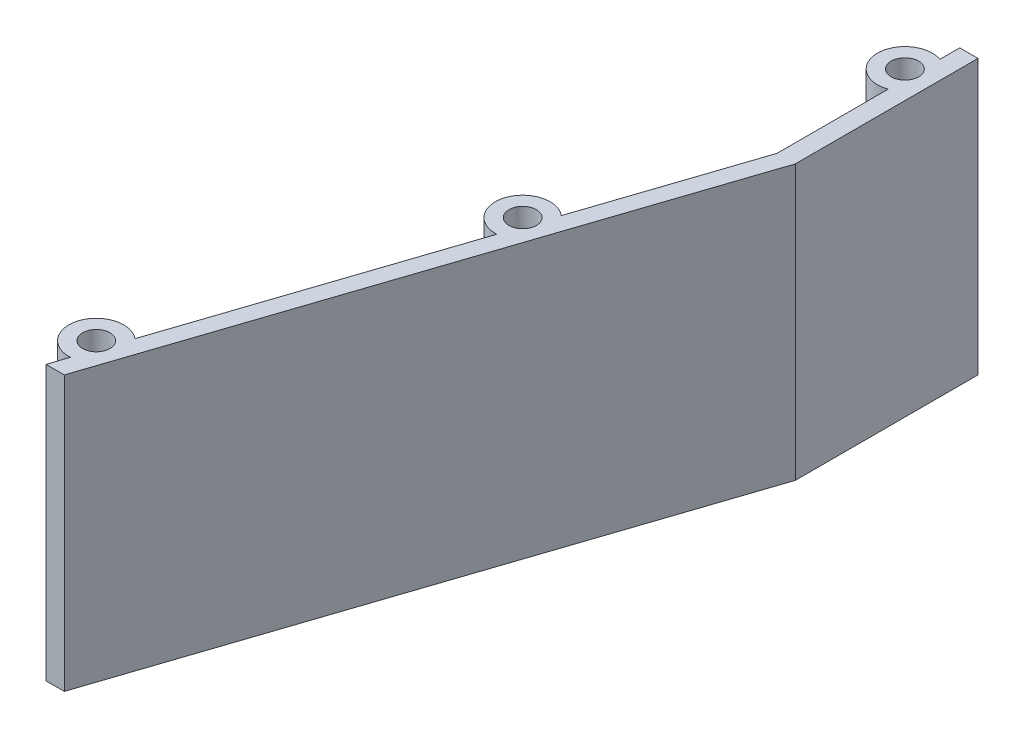
ISO-10303-21;
HEADER;
FILE_DESCRIPTION(('STEP AP214'),'2;1');
FILE_NAME('part.step','',(''),(''),'','','');
FILE_SCHEMA(('AUTOMOTIVE_DESIGN { 1 0 10303 214 1 1 1 1 }'));
ENDSEC;
DATA;
#1=APPLICATION_CONTEXT('core data for automotive mechanical design processes');
#2=APPLICATION_PROTOCOL_DEFINITION('international standard','automotive_design',2000,#1);
#3=PRODUCT_CONTEXT('',#1,'mechanical');
#4=PRODUCT('Part','Part','',(#3));
#5=PRODUCT_RELATED_PRODUCT_CATEGORY('part','',(#4));
#6=PRODUCT_DEFINITION_FORMATION('','',#4);
#7=PRODUCT_DEFINITION_CONTEXT('part definition',#1,'design');
#8=PRODUCT_DEFINITION('design','',#6,#7);
#9=PRODUCT_DEFINITION_SHAPE('','',#8);
#10=(LENGTH_UNIT() NAMED_UNIT(*) SI_UNIT(.MILLI.,.METRE.));
#11=(NAMED_UNIT(*) PLANE_ANGLE_UNIT() SI_UNIT($,.RADIAN.));
#12=(NAMED_UNIT(*) SI_UNIT($,.STERADIAN.) SOLID_ANGLE_UNIT());
#13=UNCERTAINTY_MEASURE_WITH_UNIT(LENGTH_MEASURE(1.E-05),#10,'distance_accuracy_value','');
#14=(GEOMETRIC_REPRESENTATION_CONTEXT(3) GLOBAL_UNCERTAINTY_ASSIGNED_CONTEXT((#13)) GLOBAL_UNIT_ASSIGNED_CONTEXT((#10,
#11,#12)) REPRESENTATION_CONTEXT('',''));
#15=CARTESIAN_POINT('',(0.,0.,0.));
#16=DIRECTION('',(0.,0.,1.));
#17=DIRECTION('',(1.,0.,0.));
#18=AXIS2_PLACEMENT_3D('',#15,#16,#17);
#19=CARTESIAN_POINT('',(-7.82894432683504,30.,20.));
#20=DIRECTION('',(0.,1.,0.));
#21=DIRECTION('',(0.,0.,1.));
#22=AXIS2_PLACEMENT_3D('',#19,#20,#21);
#23=PLANE('',#22);
#24=CARTESIAN_POINT('',(-1.,30.,-15.));
#25=DIRECTION('',(0.,1.,0.));
#26=DIRECTION('',(0.,0.,1.));
#27=AXIS2_PLACEMENT_3D('',#24,#25,#26);
#28=CIRCLE('',#27,1.5);
#29=CARTESIAN_POINT('',(-1.,30.,-13.5));
#30=VERTEX_POINT('',#29);
#31=EDGE_CURVE('E294',#30,#30,#28,.T.);
#32=ORIENTED_EDGE('',*,*,#31,.F.);
#33=EDGE_LOOP('',(#32));
#34=FACE_BOUND('',#33,.T.);
#35=DIRECTION('',(0.,0.,1.));
#36=VECTOR('',#35,1.);
#37=CARTESIAN_POINT('',(0.,30.,-12.1715728752538));
#38=LINE('',#37,#36);
#39=CARTESIAN_POINT('',(0.,30.,-12.1715728752538));
#40=VERTEX_POINT('',#39);
#41=CARTESIAN_POINT('',(0.,30.,0.));
#42=VERTEX_POINT('',#41);
#43=EDGE_CURVE('E185',#40,#42,#38,.T.);
#44=ORIENTED_EDGE('',*,*,#43,.T.);
#45=DIRECTION('',(-0.316227766016838,0.,0.948683298050514));
#46=VECTOR('',#45,1.);
#47=CARTESIAN_POINT('',(0.,30.,0.));
#48=LINE('',#47,#46);
#49=CARTESIAN_POINT('',(-5.90061332234473,30.,17.7018399670342));
#50=VERTEX_POINT('',#49);
#51=EDGE_CURVE('E113',#42,#50,#48,.T.);
#52=ORIENTED_EDGE('',*,*,#51,.T.);
#53=CARTESIAN_POINT('',(-7.82894432683504,30.,20.));
#54=DIRECTION('',(0.,1.,0.));
#55=DIRECTION('',(0.,0.,1.));
#56=AXIS2_PLACEMENT_3D('',#53,#54,#55);
#57=CIRCLE('',#56,3.);
#58=CARTESIAN_POINT('',(-7.66517554302228,30.,22.9955266290668));
#59=VERTEX_POINT('',#58);
#60=EDGE_CURVE('E212',#50,#59,#57,.T.);
#61=ORIENTED_EDGE('',*,*,#60,.T.);
#62=DIRECTION('',(-0.316227766016838,0.,0.948683298050514));
#63=VECTOR('',#62,1.);
#64=CARTESIAN_POINT('',(-7.66517554302228,30.,22.9955266290668));
#65=LINE('',#64,#63);
#66=CARTESIAN_POINT('',(-17.5672799890114,30.,52.7018399670342));
#67=VERTEX_POINT('',#66);
#68=EDGE_CURVE('E231',#59,#67,#65,.T.);
#69=ORIENTED_EDGE('',*,*,#68,.T.);
#70=CARTESIAN_POINT('',(-19.4956109935017,30.,55.));
#71=DIRECTION('',(0.,1.,0.));
#72=DIRECTION('',(0.,0.,1.));
#73=AXIS2_PLACEMENT_3D('',#70,#71,#72);
#74=CIRCLE('',#73,3.);
#75=CARTESIAN_POINT('',(-19.3318422096889,30.,57.9955266290668));
#76=VERTEX_POINT('',#75);
#77=EDGE_CURVE('E228',#67,#76,#74,.T.);
#78=ORIENTED_EDGE('',*,*,#77,.T.);
#79=DIRECTION('',(-0.316227766016838,0.,0.948683298050514));
#80=VECTOR('',#79,1.);
#81=CARTESIAN_POINT('',(-19.3318422096889,30.,57.9955266290668));
#82=LINE('',#81,#80);
#83=CARTESIAN_POINT('',(-20.,30.,60.));
#84=VERTEX_POINT('',#83);
#85=EDGE_CURVE('E230',#76,#84,#82,.T.);
#86=ORIENTED_EDGE('',*,*,#85,.T.);
#87=DIRECTION('',(1.,0.,0.));
#88=VECTOR('',#87,1.);
#89=CARTESIAN_POINT('',(-20.,30.,60.));
#90=LINE('',#89,#88);
#91=CARTESIAN_POINT('',(-18.,30.,60.));
#92=VERTEX_POINT('',#91);
#93=EDGE_CURVE('E233',#84,#92,#90,.T.);
#94=ORIENTED_EDGE('',*,*,#93,.T.);
#95=DIRECTION('',(0.316227766016838,0.,-0.948683298050514));
#96=VECTOR('',#95,1.);
#97=CARTESIAN_POINT('',(-18.,30.,60.));
#98=LINE('',#97,#96);
#99=CARTESIAN_POINT('',(2.,30.,0.));
#100=VERTEX_POINT('',#99);
#101=EDGE_CURVE('E239',#92,#100,#98,.T.);
#102=ORIENTED_EDGE('',*,*,#101,.T.);
#103=DIRECTION('',(0.,0.,-1.));
#104=VECTOR('',#103,1.);
#105=CARTESIAN_POINT('',(2.,30.,0.));
#106=LINE('',#105,#104);
#107=CARTESIAN_POINT('',(2.,30.,-20.));
#108=VERTEX_POINT('',#107);
#109=EDGE_CURVE('E144',#100,#108,#106,.T.);
#110=ORIENTED_EDGE('',*,*,#109,.T.);
#111=DIRECTION('',(-1.,0.,0.));
#112=VECTOR('',#111,1.);
#113=CARTESIAN_POINT('',(2.,30.,-20.));
#114=LINE('',#113,#112);
#115=CARTESIAN_POINT('',(0.,30.,-20.));
#116=VERTEX_POINT('',#115);
#117=EDGE_CURVE('E138',#108,#116,#114,.T.);
#118=ORIENTED_EDGE('',*,*,#117,.T.);
#119=DIRECTION('',(0.,0.,1.));
#120=VECTOR('',#119,1.);
#121=CARTESIAN_POINT('',(0.,30.,-20.));
#122=LINE('',#121,#120);
#123=CARTESIAN_POINT('',(0.,30.,-17.8284271247462));
#124=VERTEX_POINT('',#123);
#125=EDGE_CURVE('E142',#116,#124,#122,.T.);
#126=ORIENTED_EDGE('',*,*,#125,.T.);
#127=CARTESIAN_POINT('',(-1.,30.,-15.));
#128=DIRECTION('',(0.,1.,0.));
#129=DIRECTION('',(0.,0.,1.));
#130=AXIS2_PLACEMENT_3D('',#127,#128,#129);
#131=CIRCLE('',#130,3.);
#132=EDGE_CURVE('E58',#124,#40,#131,.T.);
#133=ORIENTED_EDGE('',*,*,#132,.T.);
#134=EDGE_LOOP('',(#44,#52,#61,#69,#78,#86,#94,#102,#110,#118,#126,#133));
#135=FACE_BOUND('',#134,.T.);
#136=CARTESIAN_POINT('',(-7.82894432683504,30.,20.));
#137=DIRECTION('',(0.,1.,0.));
#138=DIRECTION('',(0.,0.,1.));
#139=AXIS2_PLACEMENT_3D('',#136,#137,#138);
#140=CIRCLE('',#139,1.5);
#141=CARTESIAN_POINT('',(-7.82894432683504,30.,21.5));
#142=VERTEX_POINT('',#141);
#143=EDGE_CURVE('E166',#142,#142,#140,.T.);
#144=ORIENTED_EDGE('',*,*,#143,.F.);
#145=EDGE_LOOP('',(#144));
#146=FACE_BOUND('',#145,.T.);
#147=CARTESIAN_POINT('',(-19.4956109935017,30.,55.));
#148=DIRECTION('',(0.,1.,0.));
#149=DIRECTION('',(0.,0.,1.));
#150=AXIS2_PLACEMENT_3D('',#147,#148,#149);
#151=CIRCLE('',#150,1.5);
#152=CARTESIAN_POINT('',(-19.4956109935017,30.,56.5));
#153=VERTEX_POINT('',#152);
#154=EDGE_CURVE('E285',#153,#153,#151,.T.);
#155=ORIENTED_EDGE('',*,*,#154,.F.);
#156=EDGE_LOOP('',(#155));
#157=FACE_BOUND('',#156,.T.);
#158=ADVANCED_FACE('F41',(#34,#135,#146,#157),#23,.T.);
#159=CARTESIAN_POINT('',(-7.82894432683504,0.,20.));
#160=DIRECTION('',(0.,1.,0.));
#161=DIRECTION('',(0.,0.,1.));
#162=AXIS2_PLACEMENT_3D('',#159,#160,#161);
#163=PLANE('',#162);
#164=DIRECTION('',(0.,0.,1.));
#165=VECTOR('',#164,1.);
#166=CARTESIAN_POINT('',(0.,0.,-12.1715728752538));
#167=LINE('',#166,#165);
#168=CARTESIAN_POINT('',(0.,0.,-12.1715728752538));
#169=VERTEX_POINT('',#168);
#170=CARTESIAN_POINT('',(0.,0.,0.));
#171=VERTEX_POINT('',#170);
#172=EDGE_CURVE('E162',#169,#171,#167,.T.);
#173=ORIENTED_EDGE('',*,*,#172,.F.);
#174=CARTESIAN_POINT('',(-1.,0.,-15.));
#175=DIRECTION('',(0.,1.,0.));
#176=DIRECTION('',(0.,0.,1.));
#177=AXIS2_PLACEMENT_3D('',#174,#175,#176);
#178=CIRCLE('',#177,3.);
#179=CARTESIAN_POINT('',(0.,0.,-17.8284271247462));
#180=VERTEX_POINT('',#179);
#181=EDGE_CURVE('E105',#180,#169,#178,.T.);
#182=ORIENTED_EDGE('',*,*,#181,.F.);
#183=DIRECTION('',(0.,0.,1.));
#184=VECTOR('',#183,1.);
#185=CARTESIAN_POINT('',(0.,0.,-20.));
#186=LINE('',#185,#184);
#187=CARTESIAN_POINT('',(0.,0.,-20.));
#188=VERTEX_POINT('',#187);
#189=EDGE_CURVE('E99',#188,#180,#186,.T.);
#190=ORIENTED_EDGE('',*,*,#189,.F.);
#191=DIRECTION('',(-1.,0.,0.));
#192=VECTOR('',#191,1.);
#193=CARTESIAN_POINT('',(2.,0.,-20.));
#194=LINE('',#193,#192);
#195=CARTESIAN_POINT('',(2.,0.,-20.));
#196=VERTEX_POINT('',#195);
#197=EDGE_CURVE('E152',#196,#188,#194,.T.);
#198=ORIENTED_EDGE('',*,*,#197,.F.);
#199=DIRECTION('',(0.,0.,-1.));
#200=VECTOR('',#199,1.);
#201=CARTESIAN_POINT('',(2.,0.,0.));
#202=LINE('',#201,#200);
#203=CARTESIAN_POINT('',(2.,0.,0.));
#204=VERTEX_POINT('',#203);
#205=EDGE_CURVE('E180',#204,#196,#202,.T.);
#206=ORIENTED_EDGE('',*,*,#205,.F.);
#207=DIRECTION('',(0.316227766016838,0.,-0.948683298050514));
#208=VECTOR('',#207,1.);
#209=CARTESIAN_POINT('',(-18.,0.,60.));
#210=LINE('',#209,#208);
#211=CARTESIAN_POINT('',(-18.,0.,60.));
#212=VERTEX_POINT('',#211);
#213=EDGE_CURVE('E178',#212,#204,#210,.T.);
#214=ORIENTED_EDGE('',*,*,#213,.F.);
#215=DIRECTION('',(1.,0.,0.));
#216=VECTOR('',#215,1.);
#217=CARTESIAN_POINT('',(-20.,0.,60.));
#218=LINE('',#217,#216);
#219=CARTESIAN_POINT('',(-20.,0.,60.));
#220=VERTEX_POINT('',#219);
#221=EDGE_CURVE('E176',#220,#212,#218,.T.);
#222=ORIENTED_EDGE('',*,*,#221,.F.);
#223=DIRECTION('',(-0.316227766016838,0.,0.948683298050514));
#224=VECTOR('',#223,1.);
#225=CARTESIAN_POINT('',(-19.3318422096889,0.,57.9955266290668));
#226=LINE('',#225,#224);
#227=CARTESIAN_POINT('',(-19.3318422096889,0.,57.9955266290668));
#228=VERTEX_POINT('',#227);
#229=EDGE_CURVE('E174',#228,#220,#226,.T.);
#230=ORIENTED_EDGE('',*,*,#229,.F.);
#231=CARTESIAN_POINT('',(-19.4956109935017,0.,55.));
#232=DIRECTION('',(0.,1.,0.));
#233=DIRECTION('',(0.,0.,1.));
#234=AXIS2_PLACEMENT_3D('',#231,#232,#233);
#235=CIRCLE('',#234,3.);
#236=CARTESIAN_POINT('',(-17.5672799890114,0.,52.7018399670342));
#237=VERTEX_POINT('',#236);
#238=EDGE_CURVE('E172',#237,#228,#235,.T.);
#239=ORIENTED_EDGE('',*,*,#238,.F.);
#240=DIRECTION('',(-0.316227766016838,0.,0.948683298050514));
#241=VECTOR('',#240,1.);
#242=CARTESIAN_POINT('',(-7.66517554302228,0.,22.9955266290668));
#243=LINE('',#242,#241);
#244=CARTESIAN_POINT('',(-7.66517554302228,0.,22.9955266290668));
#245=VERTEX_POINT('',#244);
#246=EDGE_CURVE('E170',#245,#237,#243,.T.);
#247=ORIENTED_EDGE('',*,*,#246,.F.);
#248=CARTESIAN_POINT('',(-7.82894432683504,0.,20.));
#249=DIRECTION('',(0.,1.,0.));
#250=DIRECTION('',(0.,0.,1.));
#251=AXIS2_PLACEMENT_3D('',#248,#249,#250);
#252=CIRCLE('',#251,3.);
#253=CARTESIAN_POINT('',(-5.90061332234473,0.,17.7018399670342));
#254=VERTEX_POINT('',#253);
#255=EDGE_CURVE('E168',#254,#245,#252,.T.);
#256=ORIENTED_EDGE('',*,*,#255,.F.);
#257=DIRECTION('',(-0.316227766016838,0.,0.948683298050514));
#258=VECTOR('',#257,1.);
#259=CARTESIAN_POINT('',(0.,0.,0.));
#260=LINE('',#259,#258);
#261=EDGE_CURVE('E165',#171,#254,#260,.T.);
#262=ORIENTED_EDGE('',*,*,#261,.F.);
#263=EDGE_LOOP('',(#173,#182,#190,#198,#206,#214,#222,#230,#239,#247,#256,#262));
#264=FACE_BOUND('',#263,.T.);
#265=CARTESIAN_POINT('',(-7.82894432683504,0.,20.));
#266=DIRECTION('',(0.,1.,0.));
#267=DIRECTION('',(0.,0.,1.));
#268=AXIS2_PLACEMENT_3D('',#265,#266,#267);
#269=CIRCLE('',#268,1.5);
#270=CARTESIAN_POINT('',(-7.82894432683504,0.,21.5));
#271=VERTEX_POINT('',#270);
#272=EDGE_CURVE('E297',#271,#271,#269,.T.);
#273=ORIENTED_EDGE('',*,*,#272,.T.);
#274=EDGE_LOOP('',(#273));
#275=FACE_BOUND('',#274,.T.);
#276=CARTESIAN_POINT('',(-1.,0.,-15.));
#277=DIRECTION('',(0.,1.,0.));
#278=DIRECTION('',(0.,0.,1.));
#279=AXIS2_PLACEMENT_3D('',#276,#277,#278);
#280=CIRCLE('',#279,1.5);
#281=CARTESIAN_POINT('',(-1.,0.,-13.5));
#282=VERTEX_POINT('',#281);
#283=EDGE_CURVE('E291',#282,#282,#280,.T.);
#284=ORIENTED_EDGE('',*,*,#283,.T.);
#285=EDGE_LOOP('',(#284));
#286=FACE_BOUND('',#285,.T.);
#287=CARTESIAN_POINT('',(-19.4956109935017,0.,55.));
#288=DIRECTION('',(0.,1.,0.));
#289=DIRECTION('',(0.,0.,1.));
#290=AXIS2_PLACEMENT_3D('',#287,#288,#289);
#291=CIRCLE('',#290,1.5);
#292=CARTESIAN_POINT('',(-19.4956109935017,0.,56.5));
#293=VERTEX_POINT('',#292);
#294=EDGE_CURVE('E288',#293,#293,#291,.T.);
#295=ORIENTED_EDGE('',*,*,#294,.T.);
#296=EDGE_LOOP('',(#295));
#297=FACE_BOUND('',#296,.T.);
#298=ADVANCED_FACE('F216',(#264,#275,#286,#297),#163,.F.);
#299=CARTESIAN_POINT('',(0.,30.,-12.1715728752538));
#300=DIRECTION('',(1.,0.,0.));
#301=DIRECTION('',(0.,0.,-1.));
#302=AXIS2_PLACEMENT_3D('',#299,#300,#301);
#303=PLANE('',#302);
#304=ORIENTED_EDGE('',*,*,#172,.T.);
#305=DIRECTION('',(0.,-1.,0.));
#306=VECTOR('',#305,1.);
#307=CARTESIAN_POINT('',(0.,30.,0.));
#308=LINE('',#307,#306);
#309=EDGE_CURVE('E11',#42,#171,#308,.T.);
#310=ORIENTED_EDGE('',*,*,#309,.F.);
#311=ORIENTED_EDGE('',*,*,#43,.F.);
#312=DIRECTION('',(0.,-1.,0.));
#313=VECTOR('',#312,1.);
#314=CARTESIAN_POINT('',(0.,30.,-12.1715728752538));
#315=LINE('',#314,#313);
#316=EDGE_CURVE('E158',#40,#169,#315,.T.);
#317=ORIENTED_EDGE('',*,*,#316,.T.);
#318=EDGE_LOOP('',(#304,#310,#311,#317));
#319=FACE_BOUND('',#318,.T.);
#320=ADVANCED_FACE('F43',(#319),#303,.F.);
#321=CARTESIAN_POINT('',(0.,30.,0.));
#322=DIRECTION('',(0.948683298050514,0.,0.316227766016838));
#323=DIRECTION('',(0.316227766016838,0.,-0.948683298050514));
#324=AXIS2_PLACEMENT_3D('',#321,#322,#323);
#325=PLANE('',#324);
#326=ORIENTED_EDGE('',*,*,#261,.T.);
#327=DIRECTION('',(0.,-1.,0.));
#328=VECTOR('',#327,1.);
#329=CARTESIAN_POINT('',(-5.90061332234473,30.,17.7018399670342));
#330=LINE('',#329,#328);
#331=EDGE_CURVE('E50',#50,#254,#330,.T.);
#332=ORIENTED_EDGE('',*,*,#331,.F.);
#333=ORIENTED_EDGE('',*,*,#51,.F.);
#334=ORIENTED_EDGE('',*,*,#309,.T.);
#335=EDGE_LOOP('',(#326,#332,#333,#334));
#336=FACE_BOUND('',#335,.T.);
#337=ADVANCED_FACE('F402',(#336),#325,.F.);
#338=CARTESIAN_POINT('',(-7.82894432683504,30.,20.));
#339=DIRECTION('',(0.,-1.,0.));
#340=DIRECTION('',(0.,0.,-1.));
#341=AXIS2_PLACEMENT_3D('',#338,#339,#340);
#342=CYLINDRICAL_SURFACE('',#341,3.);
#343=ORIENTED_EDGE('',*,*,#255,.T.);
#344=DIRECTION('',(0.,-1.,0.));
#345=VECTOR('',#344,1.);
#346=CARTESIAN_POINT('',(-7.66517554302228,30.,22.9955266290668));
#347=LINE('',#346,#345);
#348=EDGE_CURVE('E204',#59,#245,#347,.T.);
#349=ORIENTED_EDGE('',*,*,#348,.F.);
#350=ORIENTED_EDGE('',*,*,#60,.F.);
#351=ORIENTED_EDGE('',*,*,#331,.T.);
#352=EDGE_LOOP('',(#343,#349,#350,#351));
#353=FACE_BOUND('',#352,.T.);
#354=ADVANCED_FACE('F210',(#353),#342,.T.);
#355=CARTESIAN_POINT('',(-7.66517554302228,30.,22.9955266290668));
#356=DIRECTION('',(0.948683298050514,0.,0.316227766016838));
#357=DIRECTION('',(0.316227766016838,0.,-0.948683298050514));
#358=AXIS2_PLACEMENT_3D('',#355,#356,#357);
#359=PLANE('',#358);
#360=ORIENTED_EDGE('',*,*,#246,.T.);
#361=DIRECTION('',(0.,-1.,0.));
#362=VECTOR('',#361,1.);
#363=CARTESIAN_POINT('',(-17.5672799890114,30.,52.7018399670342));
#364=LINE('',#363,#362);
#365=EDGE_CURVE('E201',#67,#237,#364,.T.);
#366=ORIENTED_EDGE('',*,*,#365,.F.);
#367=ORIENTED_EDGE('',*,*,#68,.F.);
#368=ORIENTED_EDGE('',*,*,#348,.T.);
#369=EDGE_LOOP('',(#360,#366,#367,#368));
#370=FACE_BOUND('',#369,.T.);
#371=ADVANCED_FACE('F222',(#370),#359,.F.);
#372=CARTESIAN_POINT('',(-19.4956109935017,30.,55.));
#373=DIRECTION('',(0.,-1.,0.));
#374=DIRECTION('',(0.,0.,-1.));
#375=AXIS2_PLACEMENT_3D('',#372,#373,#374);
#376=CYLINDRICAL_SURFACE('',#375,3.);
#377=ORIENTED_EDGE('',*,*,#238,.T.);
#378=DIRECTION('',(0.,-1.,0.));
#379=VECTOR('',#378,1.);
#380=CARTESIAN_POINT('',(-19.3318422096889,30.,57.9955266290668));
#381=LINE('',#380,#379);
#382=EDGE_CURVE('E198',#76,#228,#381,.T.);
#383=ORIENTED_EDGE('',*,*,#382,.F.);
#384=ORIENTED_EDGE('',*,*,#77,.F.);
#385=ORIENTED_EDGE('',*,*,#365,.T.);
#386=EDGE_LOOP('',(#377,#383,#384,#385));
#387=FACE_BOUND('',#386,.T.);
#388=ADVANCED_FACE('F226',(#387),#376,.T.);
#389=CARTESIAN_POINT('',(-19.3318422096889,30.,57.9955266290668));
#390=DIRECTION('',(0.948683298050514,0.,0.316227766016838));
#391=DIRECTION('',(0.316227766016838,0.,-0.948683298050514));
#392=AXIS2_PLACEMENT_3D('',#389,#390,#391);
#393=PLANE('',#392);
#394=ORIENTED_EDGE('',*,*,#229,.T.);
#395=DIRECTION('',(0.,-1.,0.));
#396=VECTOR('',#395,1.);
#397=CARTESIAN_POINT('',(-20.,30.,60.));
#398=LINE('',#397,#396);
#399=EDGE_CURVE('E195',#84,#220,#398,.T.);
#400=ORIENTED_EDGE('',*,*,#399,.F.);
#401=ORIENTED_EDGE('',*,*,#85,.F.);
#402=ORIENTED_EDGE('',*,*,#382,.T.);
#403=EDGE_LOOP('',(#394,#400,#401,#402));
#404=FACE_BOUND('',#403,.T.);
#405=ADVANCED_FACE('F367',(#404),#393,.F.);
#406=CARTESIAN_POINT('',(-20.,30.,60.));
#407=DIRECTION('',(0.,0.,-1.));
#408=DIRECTION('',(-1.,0.,0.));
#409=AXIS2_PLACEMENT_3D('',#406,#407,#408);
#410=PLANE('',#409);
#411=ORIENTED_EDGE('',*,*,#221,.T.);
#412=DIRECTION('',(0.,-1.,0.));
#413=VECTOR('',#412,1.);
#414=CARTESIAN_POINT('',(-18.,30.,60.));
#415=LINE('',#414,#413);
#416=EDGE_CURVE('E192',#92,#212,#415,.T.);
#417=ORIENTED_EDGE('',*,*,#416,.F.);
#418=ORIENTED_EDGE('',*,*,#93,.F.);
#419=ORIENTED_EDGE('',*,*,#399,.T.);
#420=EDGE_LOOP('',(#411,#417,#418,#419));
#421=FACE_BOUND('',#420,.T.);
#422=ADVANCED_FACE('F358',(#421),#410,.F.);
#423=CARTESIAN_POINT('',(-18.,30.,60.));
#424=DIRECTION('',(-0.948683298050514,0.,-0.316227766016838));
#425=DIRECTION('',(-0.316227766016838,0.,0.948683298050514));
#426=AXIS2_PLACEMENT_3D('',#423,#424,#425);
#427=PLANE('',#426);
#428=ORIENTED_EDGE('',*,*,#213,.T.);
#429=DIRECTION('',(0.,-1.,0.));
#430=VECTOR('',#429,1.);
#431=CARTESIAN_POINT('',(2.,30.,0.));
#432=LINE('',#431,#430);
#433=EDGE_CURVE('E189',#100,#204,#432,.T.);
#434=ORIENTED_EDGE('',*,*,#433,.F.);
#435=ORIENTED_EDGE('',*,*,#101,.F.);
#436=ORIENTED_EDGE('',*,*,#416,.T.);
#437=EDGE_LOOP('',(#428,#434,#435,#436));
#438=FACE_BOUND('',#437,.T.);
#439=ADVANCED_FACE('F245',(#438),#427,.F.);
#440=CARTESIAN_POINT('',(2.,30.,0.));
#441=DIRECTION('',(-1.,0.,0.));
#442=DIRECTION('',(0.,0.,1.));
#443=AXIS2_PLACEMENT_3D('',#440,#441,#442);
#444=PLANE('',#443);
#445=ORIENTED_EDGE('',*,*,#205,.T.);
#446=DIRECTION('',(0.,-1.,0.));
#447=VECTOR('',#446,1.);
#448=CARTESIAN_POINT('',(2.,30.,-20.));
#449=LINE('',#448,#447);
#450=EDGE_CURVE('E153',#108,#196,#449,.T.);
#451=ORIENTED_EDGE('',*,*,#450,.F.);
#452=ORIENTED_EDGE('',*,*,#109,.F.);
#453=ORIENTED_EDGE('',*,*,#433,.T.);
#454=EDGE_LOOP('',(#445,#451,#452,#453));
#455=FACE_BOUND('',#454,.T.);
#456=ADVANCED_FACE('F249',(#455),#444,.F.);
#457=CARTESIAN_POINT('',(2.,30.,-20.));
#458=DIRECTION('',(0.,0.,1.));
#459=DIRECTION('',(1.,0.,0.));
#460=AXIS2_PLACEMENT_3D('',#457,#458,#459);
#461=PLANE('',#460);
#462=ORIENTED_EDGE('',*,*,#197,.T.);
#463=DIRECTION('',(0.,-1.,0.));
#464=VECTOR('',#463,1.);
#465=CARTESIAN_POINT('',(0.,30.,-20.));
#466=LINE('',#465,#464);
#467=EDGE_CURVE('E149',#116,#188,#466,.T.);
#468=ORIENTED_EDGE('',*,*,#467,.F.);
#469=ORIENTED_EDGE('',*,*,#117,.F.);
#470=ORIENTED_EDGE('',*,*,#450,.T.);
#471=EDGE_LOOP('',(#462,#468,#469,#470));
#472=FACE_BOUND('',#471,.T.);
#473=ADVANCED_FACE('F150',(#472),#461,.F.);
#474=CARTESIAN_POINT('',(0.,30.,-20.));
#475=DIRECTION('',(1.,0.,0.));
#476=DIRECTION('',(0.,0.,-1.));
#477=AXIS2_PLACEMENT_3D('',#474,#475,#476);
#478=PLANE('',#477);
#479=ORIENTED_EDGE('',*,*,#189,.T.);
#480=DIRECTION('',(0.,-1.,0.));
#481=VECTOR('',#480,1.);
#482=CARTESIAN_POINT('',(0.,30.,-17.8284271247462));
#483=LINE('',#482,#481);
#484=EDGE_CURVE('E154',#124,#180,#483,.T.);
#485=ORIENTED_EDGE('',*,*,#484,.F.);
#486=ORIENTED_EDGE('',*,*,#125,.F.);
#487=ORIENTED_EDGE('',*,*,#467,.T.);
#488=EDGE_LOOP('',(#479,#485,#486,#487));
#489=FACE_BOUND('',#488,.T.);
#490=ADVANCED_FACE('F156',(#489),#478,.F.);
#491=CARTESIAN_POINT('',(-1.,30.,-15.));
#492=DIRECTION('',(0.,-1.,0.));
#493=DIRECTION('',(0.,0.,-1.));
#494=AXIS2_PLACEMENT_3D('',#491,#492,#493);
#495=CYLINDRICAL_SURFACE('',#494,3.);
#496=ORIENTED_EDGE('',*,*,#181,.T.);
#497=ORIENTED_EDGE('',*,*,#316,.F.);
#498=ORIENTED_EDGE('',*,*,#132,.F.);
#499=ORIENTED_EDGE('',*,*,#484,.T.);
#500=EDGE_LOOP('',(#496,#497,#498,#499));
#501=FACE_BOUND('',#500,.T.);
#502=ADVANCED_FACE('F253',(#501),#495,.T.);
#503=CARTESIAN_POINT('',(-7.82894432683504,30.,20.));
#504=DIRECTION('',(0.,-1.,0.));
#505=DIRECTION('',(0.,0.,-1.));
#506=AXIS2_PLACEMENT_3D('',#503,#504,#505);
#507=CYLINDRICAL_SURFACE('',#506,1.5);
#508=ORIENTED_EDGE('',*,*,#143,.T.);
#509=EDGE_LOOP('',(#508));
#510=FACE_BOUND('',#509,.T.);
#511=ORIENTED_EDGE('',*,*,#272,.F.);
#512=EDGE_LOOP('',(#511));
#513=FACE_BOUND('',#512,.T.);
#514=ADVANCED_FACE('F255',(#510,#513),#507,.F.);
#515=CARTESIAN_POINT('',(-1.,30.,-15.));
#516=DIRECTION('',(0.,-1.,0.));
#517=DIRECTION('',(0.,0.,-1.));
#518=AXIS2_PLACEMENT_3D('',#515,#516,#517);
#519=CYLINDRICAL_SURFACE('',#518,1.5);
#520=ORIENTED_EDGE('',*,*,#31,.T.);
#521=EDGE_LOOP('',(#520));
#522=FACE_BOUND('',#521,.T.);
#523=ORIENTED_EDGE('',*,*,#283,.F.);
#524=EDGE_LOOP('',(#523));
#525=FACE_BOUND('',#524,.T.);
#526=ADVANCED_FACE('F261',(#522,#525),#519,.F.);
#527=CARTESIAN_POINT('',(-19.4956109935017,30.,55.));
#528=DIRECTION('',(0.,-1.,0.));
#529=DIRECTION('',(0.,0.,-1.));
#530=AXIS2_PLACEMENT_3D('',#527,#528,#529);
#531=CYLINDRICAL_SURFACE('',#530,1.5);
#532=ORIENTED_EDGE('',*,*,#154,.T.);
#533=EDGE_LOOP('',(#532));
#534=FACE_BOUND('',#533,.T.);
#535=ORIENTED_EDGE('',*,*,#294,.F.);
#536=EDGE_LOOP('',(#535));
#537=FACE_BOUND('',#536,.T.);
#538=ADVANCED_FACE('F276',(#534,#537),#531,.F.);
#539=CLOSED_SHELL('',(#158,#298,#320,#337,#354,#371,#388,#405,#422,#439,#456,#473,#490,#502,
#514,#526,#538));
#540=MANIFOLD_SOLID_BREP('B2',#539);
#541=ADVANCED_BREP_SHAPE_REPRESENTATION('',(#18,#540),#14);
#542=SHAPE_DEFINITION_REPRESENTATION(#9,#541);
ENDSEC;
END-ISO-10303-21;
